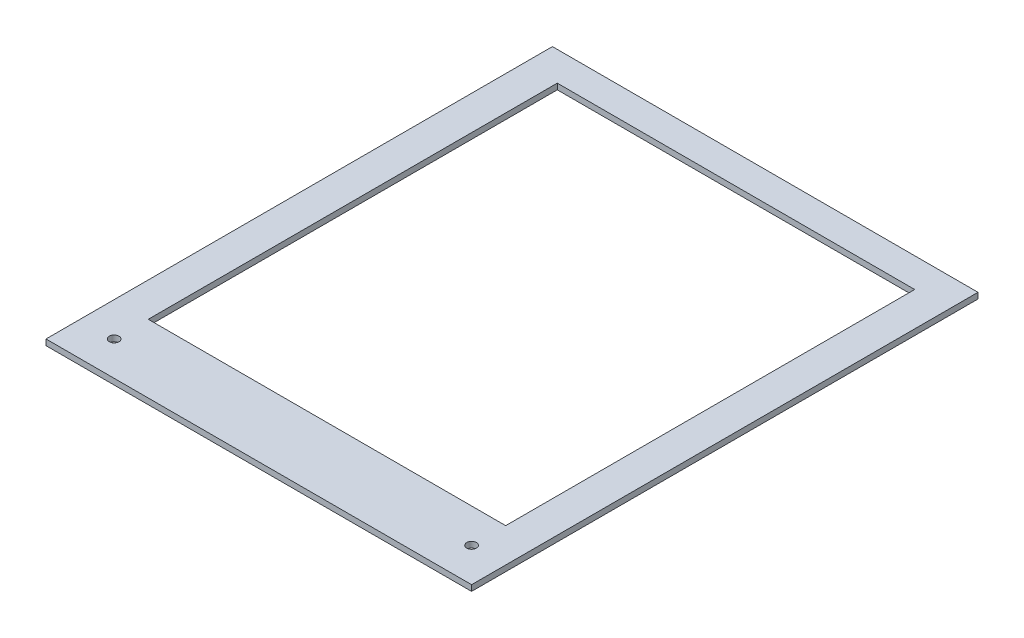
ISO-10303-21;
HEADER;
FILE_DESCRIPTION(('STEP AP214'),'2;1');
FILE_NAME('part.step','',(''),(''),'','','');
FILE_SCHEMA(('AUTOMOTIVE_DESIGN { 1 0 10303 214 1 1 1 1 }'));
ENDSEC;
DATA;
#1=APPLICATION_CONTEXT('core data for automotive mechanical design processes');
#2=APPLICATION_PROTOCOL_DEFINITION('international standard','automotive_design',2000,#1);
#3=PRODUCT_CONTEXT('',#1,'mechanical');
#4=PRODUCT('Part','Part','',(#3));
#5=PRODUCT_RELATED_PRODUCT_CATEGORY('part','',(#4));
#6=PRODUCT_DEFINITION_FORMATION('','',#4);
#7=PRODUCT_DEFINITION_CONTEXT('part definition',#1,'design');
#8=PRODUCT_DEFINITION('design','',#6,#7);
#9=PRODUCT_DEFINITION_SHAPE('','',#8);
#10=(LENGTH_UNIT() NAMED_UNIT(*) SI_UNIT(.MILLI.,.METRE.));
#11=(NAMED_UNIT(*) PLANE_ANGLE_UNIT() SI_UNIT($,.RADIAN.));
#12=(NAMED_UNIT(*) SI_UNIT($,.STERADIAN.) SOLID_ANGLE_UNIT());
#13=UNCERTAINTY_MEASURE_WITH_UNIT(LENGTH_MEASURE(1.E-05),#10,'distance_accuracy_value','');
#14=(GEOMETRIC_REPRESENTATION_CONTEXT(3) GLOBAL_UNCERTAINTY_ASSIGNED_CONTEXT((#13)) GLOBAL_UNIT_ASSIGNED_CONTEXT((#10,
#11,#12)) REPRESENTATION_CONTEXT('',''));
#15=CARTESIAN_POINT('',(0.,0.,0.));
#16=DIRECTION('',(0.,0.,1.));
#17=DIRECTION('',(1.,0.,0.));
#18=AXIS2_PLACEMENT_3D('',#15,#16,#17);
#19=CARTESIAN_POINT('',(0.,3.,140.));
#20=DIRECTION('',(0.,0.,1.));
#21=DIRECTION('',(1.,0.,0.));
#22=AXIS2_PLACEMENT_3D('',#19,#20,#21);
#23=PLANE('',#22);
#24=DIRECTION('',(-1.,0.,0.));
#25=VECTOR('',#24,1.);
#26=CARTESIAN_POINT('',(0.,0.,140.));
#27=LINE('',#26,#25);
#28=CARTESIAN_POINT('',(109.25,0.,140.));
#29=VERTEX_POINT('',#28);
#30=CARTESIAN_POINT('',(-109.25,0.,140.));
#31=VERTEX_POINT('',#30);
#32=EDGE_CURVE('E151',#29,#31,#27,.T.);
#33=ORIENTED_EDGE('',*,*,#32,.F.);
#34=DIRECTION('',(0.,-1.,0.));
#35=VECTOR('',#34,1.);
#36=CARTESIAN_POINT('',(109.25,3.,140.));
#37=LINE('',#36,#35);
#38=CARTESIAN_POINT('',(109.25,3.,140.));
#39=VERTEX_POINT('',#38);
#40=EDGE_CURVE('E11',#39,#29,#37,.T.);
#41=ORIENTED_EDGE('',*,*,#40,.F.);
#42=DIRECTION('',(-1.,0.,0.));
#43=VECTOR('',#42,1.);
#44=CARTESIAN_POINT('',(0.,3.,140.));
#45=LINE('',#44,#43);
#46=CARTESIAN_POINT('',(-109.25,3.,140.));
#47=VERTEX_POINT('',#46);
#48=EDGE_CURVE('E127',#39,#47,#45,.T.);
#49=ORIENTED_EDGE('',*,*,#48,.T.);
#50=DIRECTION('',(0.,-1.,0.));
#51=VECTOR('',#50,1.);
#52=CARTESIAN_POINT('',(-109.25,3.,140.));
#53=LINE('',#52,#51);
#54=EDGE_CURVE('E88',#47,#31,#53,.T.);
#55=ORIENTED_EDGE('',*,*,#54,.T.);
#56=EDGE_LOOP('',(#33,#41,#49,#55));
#57=FACE_BOUND('',#56,.T.);
#58=ADVANCED_FACE('F34',(#57),#23,.T.);
#59=CARTESIAN_POINT('',(109.25,3.,0.));
#60=DIRECTION('',(1.,0.,0.));
#61=DIRECTION('',(0.,0.,-1.));
#62=AXIS2_PLACEMENT_3D('',#59,#60,#61);
#63=PLANE('',#62);
#64=DIRECTION('',(0.,0.,1.));
#65=VECTOR('',#64,1.);
#66=CARTESIAN_POINT('',(109.25,0.,0.));
#67=LINE('',#66,#65);
#68=CARTESIAN_POINT('',(109.25,0.,-120.));
#69=VERTEX_POINT('',#68);
#70=EDGE_CURVE('E116',#69,#29,#67,.T.);
#71=ORIENTED_EDGE('',*,*,#70,.F.);
#72=DIRECTION('',(0.,-1.,0.));
#73=VECTOR('',#72,1.);
#74=CARTESIAN_POINT('',(109.25,3.,-120.));
#75=LINE('',#74,#73);
#76=CARTESIAN_POINT('',(109.25,3.,-120.));
#77=VERTEX_POINT('',#76);
#78=EDGE_CURVE('E44',#77,#69,#75,.T.);
#79=ORIENTED_EDGE('',*,*,#78,.F.);
#80=DIRECTION('',(0.,0.,1.));
#81=VECTOR('',#80,1.);
#82=CARTESIAN_POINT('',(109.25,3.,0.));
#83=LINE('',#82,#81);
#84=EDGE_CURVE('E114',#77,#39,#83,.T.);
#85=ORIENTED_EDGE('',*,*,#84,.T.);
#86=ORIENTED_EDGE('',*,*,#40,.T.);
#87=EDGE_LOOP('',(#71,#79,#85,#86));
#88=FACE_BOUND('',#87,.T.);
#89=ADVANCED_FACE('F112',(#88),#63,.T.);
#90=CARTESIAN_POINT('',(0.,3.,-120.));
#91=DIRECTION('',(0.,0.,1.));
#92=DIRECTION('',(1.,0.,0.));
#93=AXIS2_PLACEMENT_3D('',#90,#91,#92);
#94=PLANE('',#93);
#95=DIRECTION('',(-1.,0.,0.));
#96=VECTOR('',#95,1.);
#97=CARTESIAN_POINT('',(0.,0.,-120.));
#98=LINE('',#97,#96);
#99=CARTESIAN_POINT('',(-109.25,0.,-120.));
#100=VERTEX_POINT('',#99);
#101=EDGE_CURVE('E154',#69,#100,#98,.T.);
#102=ORIENTED_EDGE('',*,*,#101,.T.);
#103=DIRECTION('',(0.,-1.,0.));
#104=VECTOR('',#103,1.);
#105=CARTESIAN_POINT('',(-109.25,3.,-120.));
#106=LINE('',#105,#104);
#107=CARTESIAN_POINT('',(-109.25,3.,-120.));
#108=VERTEX_POINT('',#107);
#109=EDGE_CURVE('E119',#108,#100,#106,.T.);
#110=ORIENTED_EDGE('',*,*,#109,.F.);
#111=DIRECTION('',(-1.,0.,0.));
#112=VECTOR('',#111,1.);
#113=CARTESIAN_POINT('',(0.,3.,-120.));
#114=LINE('',#113,#112);
#115=EDGE_CURVE('E122',#77,#108,#114,.T.);
#116=ORIENTED_EDGE('',*,*,#115,.F.);
#117=ORIENTED_EDGE('',*,*,#78,.T.);
#118=EDGE_LOOP('',(#102,#110,#116,#117));
#119=FACE_BOUND('',#118,.T.);
#120=ADVANCED_FACE('F123',(#119),#94,.F.);
#121=CARTESIAN_POINT('',(91.75,3.,0.));
#122=DIRECTION('',(-1.,0.,0.));
#123=DIRECTION('',(0.,0.,1.));
#124=AXIS2_PLACEMENT_3D('',#121,#122,#123);
#125=PLANE('',#124);
#126=DIRECTION('',(0.,0.,-1.));
#127=VECTOR('',#126,1.);
#128=CARTESIAN_POINT('',(91.75,0.,0.));
#129=LINE('',#128,#127);
#130=CARTESIAN_POINT('',(91.75,0.,105.));
#131=VERTEX_POINT('',#130);
#132=CARTESIAN_POINT('',(91.75,0.,-105.));
#133=VERTEX_POINT('',#132);
#134=EDGE_CURVE('E141',#131,#133,#129,.T.);
#135=ORIENTED_EDGE('',*,*,#134,.F.);
#136=DIRECTION('',(0.,-1.,0.));
#137=VECTOR('',#136,1.);
#138=CARTESIAN_POINT('',(91.75,3.,105.));
#139=LINE('',#138,#137);
#140=CARTESIAN_POINT('',(91.75,3.,105.));
#141=VERTEX_POINT('',#140);
#142=EDGE_CURVE('E38',#141,#131,#139,.T.);
#143=ORIENTED_EDGE('',*,*,#142,.F.);
#144=DIRECTION('',(0.,0.,-1.));
#145=VECTOR('',#144,1.);
#146=CARTESIAN_POINT('',(91.75,3.,0.));
#147=LINE('',#146,#145);
#148=CARTESIAN_POINT('',(91.75,3.,-105.));
#149=VERTEX_POINT('',#148);
#150=EDGE_CURVE('E163',#141,#149,#147,.T.);
#151=ORIENTED_EDGE('',*,*,#150,.T.);
#152=DIRECTION('',(0.,-1.,0.));
#153=VECTOR('',#152,1.);
#154=CARTESIAN_POINT('',(91.75,3.,-105.));
#155=LINE('',#154,#153);
#156=EDGE_CURVE('E140',#149,#133,#155,.T.);
#157=ORIENTED_EDGE('',*,*,#156,.T.);
#158=EDGE_LOOP('',(#135,#143,#151,#157));
#159=FACE_BOUND('',#158,.T.);
#160=ADVANCED_FACE('F36',(#159),#125,.T.);
#161=CARTESIAN_POINT('',(0.,3.,105.));
#162=DIRECTION('',(0.,0.,1.));
#163=DIRECTION('',(1.,0.,0.));
#164=AXIS2_PLACEMENT_3D('',#161,#162,#163);
#165=PLANE('',#164);
#166=DIRECTION('',(-1.,0.,0.));
#167=VECTOR('',#166,1.);
#168=CARTESIAN_POINT('',(0.,0.,105.));
#169=LINE('',#168,#167);
#170=CARTESIAN_POINT('',(-91.75,0.,105.));
#171=VERTEX_POINT('',#170);
#172=EDGE_CURVE('E144',#131,#171,#169,.T.);
#173=ORIENTED_EDGE('',*,*,#172,.T.);
#174=DIRECTION('',(0.,-1.,0.));
#175=VECTOR('',#174,1.);
#176=CARTESIAN_POINT('',(-91.75,3.,105.));
#177=LINE('',#176,#175);
#178=CARTESIAN_POINT('',(-91.75,3.,105.));
#179=VERTEX_POINT('',#178);
#180=EDGE_CURVE('E169',#179,#171,#177,.T.);
#181=ORIENTED_EDGE('',*,*,#180,.F.);
#182=DIRECTION('',(-1.,0.,0.));
#183=VECTOR('',#182,1.);
#184=CARTESIAN_POINT('',(0.,3.,105.));
#185=LINE('',#184,#183);
#186=EDGE_CURVE('E178',#141,#179,#185,.T.);
#187=ORIENTED_EDGE('',*,*,#186,.F.);
#188=ORIENTED_EDGE('',*,*,#142,.T.);
#189=EDGE_LOOP('',(#173,#181,#187,#188));
#190=FACE_BOUND('',#189,.T.);
#191=ADVANCED_FACE('F177',(#190),#165,.F.);
#192=CARTESIAN_POINT('',(-91.75,3.,0.));
#193=DIRECTION('',(-1.,0.,0.));
#194=DIRECTION('',(0.,0.,1.));
#195=AXIS2_PLACEMENT_3D('',#192,#193,#194);
#196=PLANE('',#195);
#197=DIRECTION('',(0.,0.,-1.));
#198=VECTOR('',#197,1.);
#199=CARTESIAN_POINT('',(-91.75,0.,0.));
#200=LINE('',#199,#198);
#201=CARTESIAN_POINT('',(-91.75,0.,-105.));
#202=VERTEX_POINT('',#201);
#203=EDGE_CURVE('E146',#171,#202,#200,.T.);
#204=ORIENTED_EDGE('',*,*,#203,.T.);
#205=DIRECTION('',(0.,-1.,0.));
#206=VECTOR('',#205,1.);
#207=CARTESIAN_POINT('',(-91.75,3.,-105.));
#208=LINE('',#207,#206);
#209=CARTESIAN_POINT('',(-91.75,3.,-105.));
#210=VERTEX_POINT('',#209);
#211=EDGE_CURVE('E167',#210,#202,#208,.T.);
#212=ORIENTED_EDGE('',*,*,#211,.F.);
#213=DIRECTION('',(0.,0.,-1.));
#214=VECTOR('',#213,1.);
#215=CARTESIAN_POINT('',(-91.75,3.,0.));
#216=LINE('',#215,#214);
#217=EDGE_CURVE('E189',#179,#210,#216,.T.);
#218=ORIENTED_EDGE('',*,*,#217,.F.);
#219=ORIENTED_EDGE('',*,*,#180,.T.);
#220=EDGE_LOOP('',(#204,#212,#218,#219));
#221=FACE_BOUND('',#220,.T.);
#222=ADVANCED_FACE('F188',(#221),#196,.F.);
#223=CARTESIAN_POINT('',(-91.75,3.,122.5));
#224=DIRECTION('',(0.,-1.,0.));
#225=DIRECTION('',(0.,0.,-1.));
#226=AXIS2_PLACEMENT_3D('',#223,#224,#225);
#227=CYLINDRICAL_SURFACE('',#226,2.5);
#228=CARTESIAN_POINT('',(-91.75,3.,122.5));
#229=DIRECTION('',(0.,1.,0.));
#230=DIRECTION('',(0.,0.,1.));
#231=AXIS2_PLACEMENT_3D('',#228,#229,#230);
#232=CIRCLE('',#231,2.5);
#233=CARTESIAN_POINT('',(-91.75,3.,125.));
#234=VERTEX_POINT('',#233);
#235=EDGE_CURVE('E134',#234,#234,#232,.T.);
#236=ORIENTED_EDGE('',*,*,#235,.T.);
#237=EDGE_LOOP('',(#236));
#238=FACE_BOUND('',#237,.T.);
#239=CARTESIAN_POINT('',(-91.75,0.,122.5));
#240=DIRECTION('',(0.,1.,0.));
#241=DIRECTION('',(0.,0.,1.));
#242=AXIS2_PLACEMENT_3D('',#239,#240,#241);
#243=CIRCLE('',#242,2.5);
#244=CARTESIAN_POINT('',(-91.75,0.,125.));
#245=VERTEX_POINT('',#244);
#246=EDGE_CURVE('E157',#245,#245,#243,.T.);
#247=ORIENTED_EDGE('',*,*,#246,.F.);
#248=EDGE_LOOP('',(#247));
#249=FACE_BOUND('',#248,.T.);
#250=ADVANCED_FACE('F216',(#238,#249),#227,.F.);
#251=CARTESIAN_POINT('',(-109.25,3.,0.));
#252=DIRECTION('',(1.,0.,0.));
#253=DIRECTION('',(0.,0.,-1.));
#254=AXIS2_PLACEMENT_3D('',#251,#252,#253);
#255=PLANE('',#254);
#256=DIRECTION('',(0.,0.,1.));
#257=VECTOR('',#256,1.);
#258=CARTESIAN_POINT('',(-109.25,0.,0.));
#259=LINE('',#258,#257);
#260=EDGE_CURVE('E81',#100,#31,#259,.T.);
#261=ORIENTED_EDGE('',*,*,#260,.T.);
#262=ORIENTED_EDGE('',*,*,#54,.F.);
#263=DIRECTION('',(0.,0.,1.));
#264=VECTOR('',#263,1.);
#265=CARTESIAN_POINT('',(-109.25,3.,0.));
#266=LINE('',#265,#264);
#267=EDGE_CURVE('E53',#108,#47,#266,.T.);
#268=ORIENTED_EDGE('',*,*,#267,.F.);
#269=ORIENTED_EDGE('',*,*,#109,.T.);
#270=EDGE_LOOP('',(#261,#262,#268,#269));
#271=FACE_BOUND('',#270,.T.);
#272=ADVANCED_FACE('F214',(#271),#255,.F.);
#273=CARTESIAN_POINT('',(0.,3.,-105.));
#274=DIRECTION('',(0.,0.,-1.));
#275=DIRECTION('',(-1.,0.,0.));
#276=AXIS2_PLACEMENT_3D('',#273,#274,#275);
#277=PLANE('',#276);
#278=DIRECTION('',(1.,0.,0.));
#279=VECTOR('',#278,1.);
#280=CARTESIAN_POINT('',(0.,0.,-105.));
#281=LINE('',#280,#279);
#282=EDGE_CURVE('E148',#202,#133,#281,.T.);
#283=ORIENTED_EDGE('',*,*,#282,.T.);
#284=ORIENTED_EDGE('',*,*,#156,.F.);
#285=DIRECTION('',(1.,0.,0.));
#286=VECTOR('',#285,1.);
#287=CARTESIAN_POINT('',(0.,3.,-105.));
#288=LINE('',#287,#286);
#289=EDGE_CURVE('E129',#210,#149,#288,.T.);
#290=ORIENTED_EDGE('',*,*,#289,.F.);
#291=ORIENTED_EDGE('',*,*,#211,.T.);
#292=EDGE_LOOP('',(#283,#284,#290,#291));
#293=FACE_BOUND('',#292,.T.);
#294=ADVANCED_FACE('F186',(#293),#277,.F.);
#295=CARTESIAN_POINT('',(91.75,3.,122.5));
#296=DIRECTION('',(0.,-1.,0.));
#297=DIRECTION('',(0.,0.,-1.));
#298=AXIS2_PLACEMENT_3D('',#295,#296,#297);
#299=CYLINDRICAL_SURFACE('',#298,2.50000000000001);
#300=CARTESIAN_POINT('',(91.75,3.,122.5));
#301=DIRECTION('',(0.,1.,0.));
#302=DIRECTION('',(0.,0.,1.));
#303=AXIS2_PLACEMENT_3D('',#300,#301,#302);
#304=CIRCLE('',#303,2.50000000000001);
#305=CARTESIAN_POINT('',(91.75,3.,125.));
#306=VERTEX_POINT('',#305);
#307=EDGE_CURVE('E137',#306,#306,#304,.T.);
#308=ORIENTED_EDGE('',*,*,#307,.T.);
#309=EDGE_LOOP('',(#308));
#310=FACE_BOUND('',#309,.T.);
#311=CARTESIAN_POINT('',(91.75,0.,122.5));
#312=DIRECTION('',(0.,1.,0.));
#313=DIRECTION('',(0.,0.,1.));
#314=AXIS2_PLACEMENT_3D('',#311,#312,#313);
#315=CIRCLE('',#314,2.50000000000001);
#316=CARTESIAN_POINT('',(91.75,0.,125.));
#317=VERTEX_POINT('',#316);
#318=EDGE_CURVE('E160',#317,#317,#315,.T.);
#319=ORIENTED_EDGE('',*,*,#318,.F.);
#320=EDGE_LOOP('',(#319));
#321=FACE_BOUND('',#320,.T.);
#322=ADVANCED_FACE('F195',(#310,#321),#299,.F.);
#323=CARTESIAN_POINT('',(0.,3.,0.));
#324=DIRECTION('',(0.,1.,0.));
#325=DIRECTION('',(0.,0.,1.));
#326=AXIS2_PLACEMENT_3D('',#323,#324,#325);
#327=PLANE('',#326);
#328=ORIENTED_EDGE('',*,*,#150,.F.);
#329=ORIENTED_EDGE('',*,*,#186,.T.);
#330=ORIENTED_EDGE('',*,*,#217,.T.);
#331=ORIENTED_EDGE('',*,*,#289,.T.);
#332=EDGE_LOOP('',(#328,#329,#330,#331));
#333=FACE_BOUND('',#332,.T.);
#334=ORIENTED_EDGE('',*,*,#48,.F.);
#335=ORIENTED_EDGE('',*,*,#84,.F.);
#336=ORIENTED_EDGE('',*,*,#115,.T.);
#337=ORIENTED_EDGE('',*,*,#267,.T.);
#338=EDGE_LOOP('',(#334,#335,#336,#337));
#339=FACE_BOUND('',#338,.T.);
#340=ORIENTED_EDGE('',*,*,#235,.F.);
#341=EDGE_LOOP('',(#340));
#342=FACE_BOUND('',#341,.T.);
#343=ORIENTED_EDGE('',*,*,#307,.F.);
#344=EDGE_LOOP('',(#343));
#345=FACE_BOUND('',#344,.T.);
#346=ADVANCED_FACE('F125',(#333,#339,#342,#345),#327,.T.);
#347=CARTESIAN_POINT('',(0.,0.,0.));
#348=DIRECTION('',(0.,1.,0.));
#349=DIRECTION('',(0.,0.,1.));
#350=AXIS2_PLACEMENT_3D('',#347,#348,#349);
#351=PLANE('',#350);
#352=ORIENTED_EDGE('',*,*,#134,.T.);
#353=ORIENTED_EDGE('',*,*,#282,.F.);
#354=ORIENTED_EDGE('',*,*,#203,.F.);
#355=ORIENTED_EDGE('',*,*,#172,.F.);
#356=EDGE_LOOP('',(#352,#353,#354,#355));
#357=FACE_BOUND('',#356,.T.);
#358=ORIENTED_EDGE('',*,*,#32,.T.);
#359=ORIENTED_EDGE('',*,*,#260,.F.);
#360=ORIENTED_EDGE('',*,*,#101,.F.);
#361=ORIENTED_EDGE('',*,*,#70,.T.);
#362=EDGE_LOOP('',(#358,#359,#360,#361));
#363=FACE_BOUND('',#362,.T.);
#364=ORIENTED_EDGE('',*,*,#246,.T.);
#365=EDGE_LOOP('',(#364));
#366=FACE_BOUND('',#365,.T.);
#367=ORIENTED_EDGE('',*,*,#318,.T.);
#368=EDGE_LOOP('',(#367));
#369=FACE_BOUND('',#368,.T.);
#370=ADVANCED_FACE('F181',(#357,#363,#366,#369),#351,.F.);
#371=CLOSED_SHELL('',(#58,#89,#120,#160,#191,#222,#250,#272,#294,#322,#346,#370));
#372=MANIFOLD_SOLID_BREP('B2',#371);
#373=ADVANCED_BREP_SHAPE_REPRESENTATION('',(#18,#372),#14);
#374=SHAPE_DEFINITION_REPRESENTATION(#9,#373);
ENDSEC;
END-ISO-10303-21;
